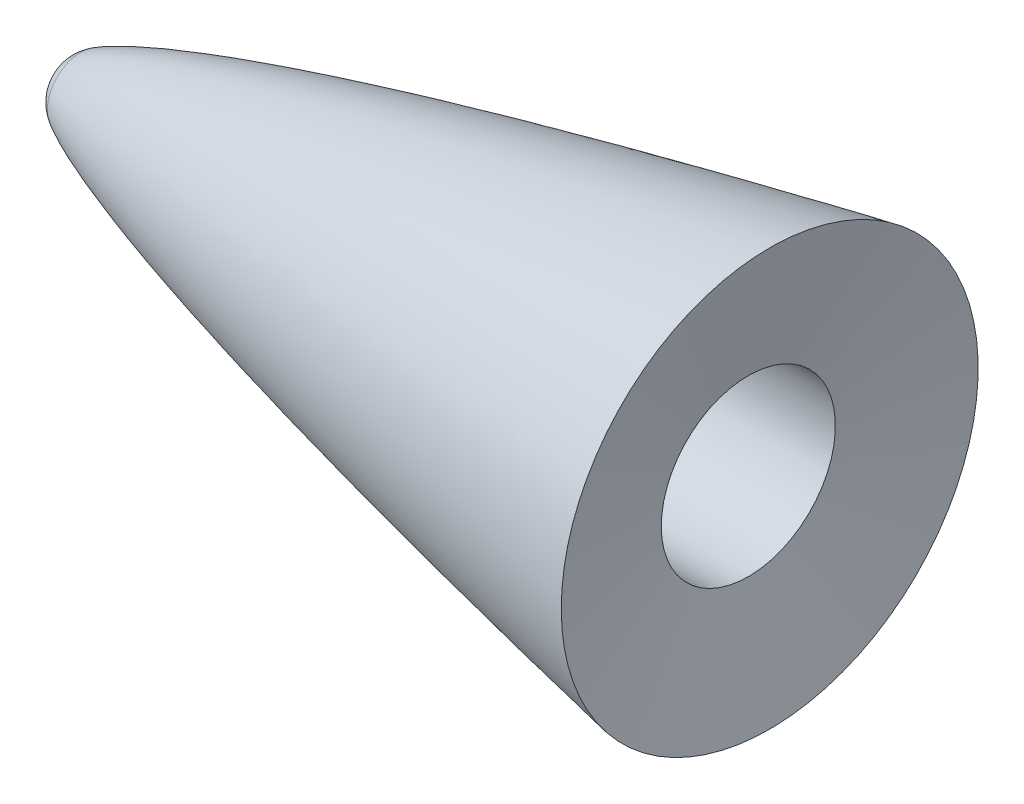
ISO-10303-21;
HEADER;
FILE_DESCRIPTION(('STEP AP214'),'2;1');
FILE_NAME('part.step','',(''),(''),'','','');
FILE_SCHEMA(('AUTOMOTIVE_DESIGN { 1 0 10303 214 1 1 1 1 }'));
ENDSEC;
DATA;
#1=APPLICATION_CONTEXT('core data for automotive mechanical design processes');
#2=APPLICATION_PROTOCOL_DEFINITION('international standard','automotive_design',2000,#1);
#3=PRODUCT_CONTEXT('',#1,'mechanical');
#4=PRODUCT('Part','Part','',(#3));
#5=PRODUCT_RELATED_PRODUCT_CATEGORY('part','',(#4));
#6=PRODUCT_DEFINITION_FORMATION('','',#4);
#7=PRODUCT_DEFINITION_CONTEXT('part definition',#1,'design');
#8=PRODUCT_DEFINITION('design','',#6,#7);
#9=PRODUCT_DEFINITION_SHAPE('','',#8);
#10=(LENGTH_UNIT() NAMED_UNIT(*) SI_UNIT(.MILLI.,.METRE.));
#11=(NAMED_UNIT(*) PLANE_ANGLE_UNIT() SI_UNIT($,.RADIAN.));
#12=(NAMED_UNIT(*) SI_UNIT($,.STERADIAN.) SOLID_ANGLE_UNIT());
#13=UNCERTAINTY_MEASURE_WITH_UNIT(LENGTH_MEASURE(1.E-05),#10,'distance_accuracy_value','');
#14=(GEOMETRIC_REPRESENTATION_CONTEXT(3) GLOBAL_UNCERTAINTY_ASSIGNED_CONTEXT((#13)) GLOBAL_UNIT_ASSIGNED_CONTEXT((#10,
#11,#12)) REPRESENTATION_CONTEXT('',''));
#15=CARTESIAN_POINT('',(0.,0.,0.));
#16=DIRECTION('',(0.,0.,1.));
#17=DIRECTION('',(1.,0.,0.));
#18=AXIS2_PLACEMENT_3D('',#15,#16,#17);
#19=CARTESIAN_POINT('',(50.8000000002818,15.2019000000496,0.));
#20=CARTESIAN_POINT('',(49.9242152612325,15.0331643009153,0.));
#21=CARTESIAN_POINT('',(48.1803565570134,14.6946266738902,0.));
#22=CARTESIAN_POINT('',(44.7622604631195,14.0242497254642,0.));
#23=CARTESIAN_POINT('',(41.3537005773465,13.3342131969563,0.));
#24=CARTESIAN_POINT('',(37.2558124715789,12.4918856278581,0.));
#25=CARTESIAN_POINT('',(33.5814236288075,11.7093606958729,0.));
#26=CARTESIAN_POINT('',(29.6577678631417,10.8540562090419,0.));
#27=CARTESIAN_POINT('',(25.8948902485087,10.0012987382655,0.));
#28=CARTESIAN_POINT('',(22.0450435098878,9.09830154269429,0.));
#29=CARTESIAN_POINT('',(18.2622206507131,8.168123108199,0.));
#30=CARTESIAN_POINT('',(14.4554589280349,7.18310510784163,0.));
#31=CARTESIAN_POINT('',(10.6918612518119,6.14170179942477,0.));
#32=CARTESIAN_POINT('',(7.40657203307693,5.15136690211234,0.));
#33=CARTESIAN_POINT('',(4.74276942207049,4.25846108505661,0.));
#34=CARTESIAN_POINT('',(2.83007419425502,3.52792893395474,0.));
#35=CARTESIAN_POINT('',(1.73030702659888,3.05319015141187,0.));
#36=CARTESIAN_POINT('',(1.06060092635513,2.72368345857672,0.));
#37=CARTESIAN_POINT('',(0.730047936517193,2.54063648016491,0.));
#38=CARTESIAN_POINT('',(0.587417186890754,2.45544731573781,0.));
#39=CARTESIAN_POINT('',(0.556083667021455,2.43637906076547,0.));
#40=B_SPLINE_CURVE_WITH_KNOTS('',4,(#19,#20,#21,#22,#23,#24,#25,#26,#27,#28,#29,#30,#31,#32,#33,
#34,#35,#36,#37,#38,#39),.UNSPECIFIED.,.F.,.F.,(5,1,1,1,1,1,1,1,1,1,1,1,1,1,1,1,1,5),
(0.0125028781153957,0.0802452041625899,0.147987530343243,0.215729856039558,0.283472181566584,
0.351214507856622,0.418956834742745,0.486699159418571,0.554441484479953,0.62218380986386,
0.689926132730293,0.757668459764284,0.825160309614804,0.859031479478731,0.884450350560367,
0.899100590750392,0.908053377611868,0.910589850332838),.UNSPECIFIED.);
#41=CARTESIAN_POINT('',(3.51933759912271E-10,6.31508734194597E-11,0.));
#42=DIRECTION('',(-1.,0.,0.));
#43=AXIS1_PLACEMENT('',#41,#42);
#44=SURFACE_OF_REVOLUTION('',#40,#43);
#45=CARTESIAN_POINT('',(0.556083667021523,6.31508734194597E-11,0.));
#46=DIRECTION('',(-1.,0.,0.));
#47=DIRECTION('',(0.,0.,1.));
#48=AXIS2_PLACEMENT_3D('',#45,#46,#47);
#49=CIRCLE('',#48,2.43637906070236);
#50=CARTESIAN_POINT('',(0.556083667021523,6.31508734194597E-11,2.43637906070236));
#51=VERTEX_POINT('',#50);
#52=EDGE_CURVE('E11',#51,#51,#49,.T.);
#53=ORIENTED_EDGE('',*,*,#52,.F.);
#54=EDGE_LOOP('',(#53));
#55=FACE_BOUND('',#54,.T.);
#56=CARTESIAN_POINT('',(50.8000000003519,6.31508734194597E-11,0.));
#57=DIRECTION('',(-1.,0.,0.));
#58=DIRECTION('',(0.,0.,1.));
#59=AXIS2_PLACEMENT_3D('',#56,#57,#58);
#60=CIRCLE('',#59,15.2019);
#61=CARTESIAN_POINT('',(50.8000000003519,6.31508734194597E-11,15.2019));
#62=VERTEX_POINT('',#61);
#63=EDGE_CURVE('E66',#62,#62,#60,.T.);
#64=ORIENTED_EDGE('',*,*,#63,.T.);
#65=EDGE_LOOP('',(#64));
#66=FACE_BOUND('',#65,.T.);
#67=ADVANCED_FACE('F33',(#55,#66),#44,.T.);
#68=CARTESIAN_POINT('',(2.0387609187834,6.31508734194597E-11,0.));
#69=DIRECTION('',(-1.,0.,0.));
#70=DIRECTION('',(0.,1.,0.));
#71=AXIS2_PLACEMENT_3D('',#68,#69,#70);
#72=SPHERICAL_SURFACE('',#71,2.8520649993156);
#73=ORIENTED_EDGE('',*,*,#52,.T.);
#74=EDGE_LOOP('',(#73));
#75=FACE_BOUND('',#74,.T.);
#76=ADVANCED_FACE('F46',(#75),#72,.T.);
#77=CARTESIAN_POINT('',(33.9089150787494,6.31508734194597E-11,0.));
#78=DIRECTION('',(1.,0.,0.));
#79=DIRECTION('',(0.,0.,-1.));
#80=AXIS2_PLACEMENT_3D('',#77,#78,#79);
#81=CONICAL_SURFACE('',#80,0.,1.17809724509617);
#82=CARTESIAN_POINT('',(36.5391711998186,6.31508734194597E-11,0.));
#83=DIRECTION('',(-1.,0.,0.));
#84=DIRECTION('',(0.,0.,1.));
#85=AXIS2_PLACEMENT_3D('',#82,#83,#84);
#86=CIRCLE('',#85,6.35);
#87=CARTESIAN_POINT('',(36.5391711998186,6.31508734194597E-11,6.35));
#88=VERTEX_POINT('',#87);
#89=EDGE_CURVE('E40',#88,#88,#86,.T.);
#90=ORIENTED_EDGE('',*,*,#89,.F.);
#91=EDGE_LOOP('',(#90));
#92=FACE_BOUND('',#91,.T.);
#93=CARTESIAN_POINT('',(33.9089150787494,6.31508734194597E-11,0.));
#94=VERTEX_POINT('',#93);
#95=VERTEX_LOOP('',#94);
#96=FACE_BOUND('',#95,.T.);
#97=ADVANCED_FACE('F43',(#92,#96),#81,.F.);
#98=CARTESIAN_POINT('',(3.51933759912271E-10,6.31508734194597E-11,0.));
#99=DIRECTION('',(-1.,0.,0.));
#100=DIRECTION('',(0.,0.,1.));
#101=AXIS2_PLACEMENT_3D('',#98,#99,#100);
#102=CYLINDRICAL_SURFACE('',#101,6.35);
#103=CARTESIAN_POINT('',(49.2391711998186,6.31508734194597E-11,0.));
#104=DIRECTION('',(-1.,0.,0.));
#105=DIRECTION('',(0.,0.,1.));
#106=AXIS2_PLACEMENT_3D('',#103,#104,#105);
#107=CIRCLE('',#106,6.35);
#108=CARTESIAN_POINT('',(49.2391711998186,6.31508734194597E-11,6.35));
#109=VERTEX_POINT('',#108);
#110=EDGE_CURVE('E68',#109,#109,#107,.T.);
#111=ORIENTED_EDGE('',*,*,#110,.F.);
#112=EDGE_LOOP('',(#111));
#113=FACE_BOUND('',#112,.T.);
#114=ORIENTED_EDGE('',*,*,#89,.T.);
#115=EDGE_LOOP('',(#114));
#116=FACE_BOUND('',#115,.T.);
#117=ADVANCED_FACE('F45',(#113,#116),#102,.F.);
#118=CARTESIAN_POINT('',(49.2391711998186,6.31508734194597E-11,0.));
#119=DIRECTION('',(1.,0.,0.));
#120=DIRECTION('',(0.,0.,-1.));
#121=AXIS2_PLACEMENT_3D('',#118,#119,#120);
#122=CONICAL_SURFACE('',#121,6.35,1.39626340159546);
#123=ORIENTED_EDGE('',*,*,#63,.F.);
#124=EDGE_LOOP('',(#123));
#125=FACE_BOUND('',#124,.T.);
#126=ORIENTED_EDGE('',*,*,#110,.T.);
#127=EDGE_LOOP('',(#126));
#128=FACE_BOUND('',#127,.T.);
#129=ADVANCED_FACE('F53',(#125,#128),#122,.F.);
#130=CLOSED_SHELL('',(#67,#76,#97,#117,#129));
#131=MANIFOLD_SOLID_BREP('B2',#130);
#132=ADVANCED_BREP_SHAPE_REPRESENTATION('',(#18,#131),#14);
#133=SHAPE_DEFINITION_REPRESENTATION(#9,#132);
ENDSEC;
END-ISO-10303-21;
